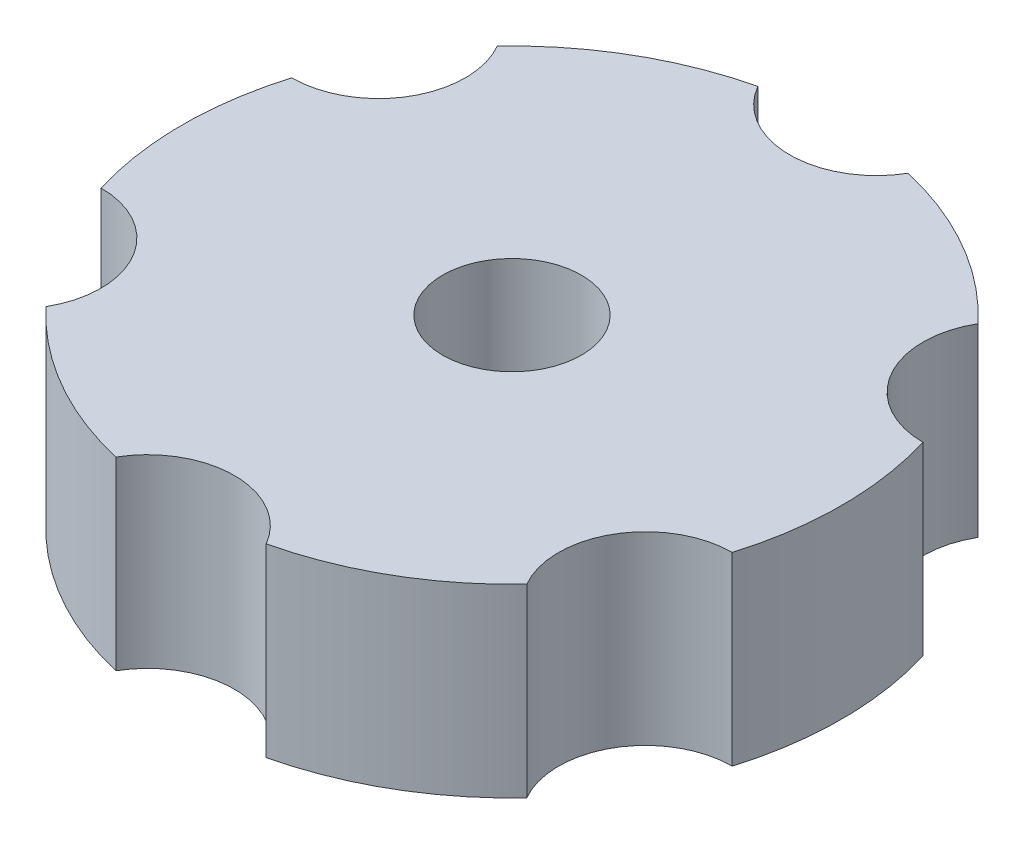
ISO-10303-21;
HEADER;
FILE_DESCRIPTION(('STEP AP214'),'2;1');
FILE_NAME('part.step','',(''),(''),'','','');
FILE_SCHEMA(('AUTOMOTIVE_DESIGN { 1 0 10303 214 1 1 1 1 }'));
ENDSEC;
DATA;
#1=APPLICATION_CONTEXT('core data for automotive mechanical design processes');
#2=APPLICATION_PROTOCOL_DEFINITION('international standard','automotive_design',2000,#1);
#3=PRODUCT_CONTEXT('',#1,'mechanical');
#4=PRODUCT('Part','Part','',(#3));
#5=PRODUCT_RELATED_PRODUCT_CATEGORY('part','',(#4));
#6=PRODUCT_DEFINITION_FORMATION('','',#4);
#7=PRODUCT_DEFINITION_CONTEXT('part definition',#1,'design');
#8=PRODUCT_DEFINITION('design','',#6,#7);
#9=PRODUCT_DEFINITION_SHAPE('','',#8);
#10=(LENGTH_UNIT() NAMED_UNIT(*) SI_UNIT(.MILLI.,.METRE.));
#11=(NAMED_UNIT(*) PLANE_ANGLE_UNIT() SI_UNIT($,.RADIAN.));
#12=(NAMED_UNIT(*) SI_UNIT($,.STERADIAN.) SOLID_ANGLE_UNIT());
#13=UNCERTAINTY_MEASURE_WITH_UNIT(LENGTH_MEASURE(1.E-05),#10,'distance_accuracy_value','');
#14=(GEOMETRIC_REPRESENTATION_CONTEXT(3) GLOBAL_UNCERTAINTY_ASSIGNED_CONTEXT((#13)) GLOBAL_UNIT_ASSIGNED_CONTEXT((#10,
#11,#12)) REPRESENTATION_CONTEXT('',''));
#15=CARTESIAN_POINT('',(0.,0.,0.));
#16=DIRECTION('',(0.,0.,1.));
#17=DIRECTION('',(1.,0.,0.));
#18=AXIS2_PLACEMENT_3D('',#15,#16,#17);
#19=CARTESIAN_POINT('',(-27.2879949785759,16.,-15.7547312465264));
#20=DIRECTION('',(0.,-1.,0.));
#21=DIRECTION('',(0.,0.,-1.));
#22=AXIS2_PLACEMENT_3D('',#19,#20,#21);
#23=CYLINDRICAL_SURFACE('',#22,7.50946249305215);
#24=CARTESIAN_POINT('',(-27.2879949785759,0.,-15.7547312465264));
#25=DIRECTION('',(0.,1.,0.));
#26=DIRECTION('',(0.,0.,1.));
#27=AXIS2_PLACEMENT_3D('',#24,#25,#26);
#28=CIRCLE('',#27,7.50946249305215);
#29=CARTESIAN_POINT('',(-27.2812296813957,0.,-8.24527180091308));
#30=VERTEX_POINT('',#29);
#31=CARTESIAN_POINT('',(-20.7812296813956,0.,-19.5036020501107));
#32=VERTEX_POINT('',#31);
#33=EDGE_CURVE('E164',#30,#32,#28,.T.);
#34=ORIENTED_EDGE('',*,*,#33,.F.);
#35=DIRECTION('',(0.,-1.,0.));
#36=VECTOR('',#35,1.);
#37=CARTESIAN_POINT('',(-27.2812296813957,16.,-8.24527180091308));
#38=LINE('',#37,#36);
#39=CARTESIAN_POINT('',(-27.2812296813957,16.,-8.24527180091308));
#40=VERTEX_POINT('',#39);
#41=EDGE_CURVE('E11',#40,#30,#38,.T.);
#42=ORIENTED_EDGE('',*,*,#41,.F.);
#43=CARTESIAN_POINT('',(-27.2879949785759,16.,-15.7547312465264));
#44=DIRECTION('',(0.,1.,0.));
#45=DIRECTION('',(0.,0.,1.));
#46=AXIS2_PLACEMENT_3D('',#43,#44,#45);
#47=CIRCLE('',#46,7.50946249305215);
#48=CARTESIAN_POINT('',(-20.7812296813956,16.,-19.5036020501107));
#49=VERTEX_POINT('',#48);
#50=EDGE_CURVE('E229',#40,#49,#47,.T.);
#51=ORIENTED_EDGE('',*,*,#50,.T.);
#52=DIRECTION('',(0.,-1.,0.));
#53=VECTOR('',#52,1.);
#54=CARTESIAN_POINT('',(-20.7812296813956,16.,-19.5036020501107));
#55=LINE('',#54,#53);
#56=EDGE_CURVE('E104',#49,#32,#55,.T.);
#57=ORIENTED_EDGE('',*,*,#56,.T.);
#58=EDGE_LOOP('',(#34,#42,#51,#57));
#59=FACE_BOUND('',#58,.T.);
#60=ADVANCED_FACE('F41',(#59),#23,.F.);
#61=CARTESIAN_POINT('',(0.,16.,0.));
#62=DIRECTION('',(0.,-1.,0.));
#63=DIRECTION('',(0.,0.,-1.));
#64=AXIS2_PLACEMENT_3D('',#61,#62,#63);
#65=CYLINDRICAL_SURFACE('',#64,28.5);
#66=CARTESIAN_POINT('',(0.,0.,0.));
#67=DIRECTION('',(0.,1.,0.));
#68=DIRECTION('',(0.,0.,1.));
#69=AXIS2_PLACEMENT_3D('',#66,#67,#68);
#70=CIRCLE('',#69,28.5);
#71=CARTESIAN_POINT('',(-27.2812296813959,0.,8.24527180091251));
#72=VERTEX_POINT('',#71);
#73=EDGE_CURVE('E167',#30,#72,#70,.T.);
#74=ORIENTED_EDGE('',*,*,#73,.T.);
#75=DIRECTION('',(0.,-1.,0.));
#76=VECTOR('',#75,1.);
#77=CARTESIAN_POINT('',(-27.2812296813959,16.,8.24527180091251));
#78=LINE('',#77,#76);
#79=CARTESIAN_POINT('',(-27.2812296813959,16.,8.24527180091251));
#80=VERTEX_POINT('',#79);
#81=EDGE_CURVE('E50',#80,#72,#78,.T.);
#82=ORIENTED_EDGE('',*,*,#81,.F.);
#83=CARTESIAN_POINT('',(0.,16.,0.));
#84=DIRECTION('',(0.,1.,0.));
#85=DIRECTION('',(0.,0.,1.));
#86=AXIS2_PLACEMENT_3D('',#83,#84,#85);
#87=CIRCLE('',#86,28.5);
#88=EDGE_CURVE('E157',#40,#80,#87,.T.);
#89=ORIENTED_EDGE('',*,*,#88,.F.);
#90=ORIENTED_EDGE('',*,*,#41,.T.);
#91=EDGE_LOOP('',(#74,#82,#89,#90));
#92=FACE_BOUND('',#91,.T.);
#93=ADVANCED_FACE('F211',(#92),#65,.T.);
#94=CARTESIAN_POINT('',(-27.2879949785763,16.,15.7547312465258));
#95=DIRECTION('',(0.,-1.,0.));
#96=DIRECTION('',(0.,0.,-1.));
#97=AXIS2_PLACEMENT_3D('',#94,#95,#96);
#98=CYLINDRICAL_SURFACE('',#97,7.50946249305215);
#99=CARTESIAN_POINT('',(-27.2879949785763,0.,15.7547312465258));
#100=DIRECTION('',(0.,1.,0.));
#101=DIRECTION('',(0.,0.,1.));
#102=AXIS2_PLACEMENT_3D('',#99,#100,#101);
#103=CIRCLE('',#102,7.50946249305215);
#104=CARTESIAN_POINT('',(-20.781229681396,0.,19.5036020501103));
#105=VERTEX_POINT('',#104);
#106=EDGE_CURVE('E170',#105,#72,#103,.T.);
#107=ORIENTED_EDGE('',*,*,#106,.F.);
#108=DIRECTION('',(0.,-1.,0.));
#109=VECTOR('',#108,1.);
#110=CARTESIAN_POINT('',(-20.781229681396,16.,19.5036020501103));
#111=LINE('',#110,#109);
#112=CARTESIAN_POINT('',(-20.781229681396,16.,19.5036020501103));
#113=VERTEX_POINT('',#112);
#114=EDGE_CURVE('E201',#113,#105,#111,.T.);
#115=ORIENTED_EDGE('',*,*,#114,.F.);
#116=CARTESIAN_POINT('',(-27.2879949785763,16.,15.7547312465258));
#117=DIRECTION('',(0.,1.,0.));
#118=DIRECTION('',(0.,0.,1.));
#119=AXIS2_PLACEMENT_3D('',#116,#117,#118);
#120=CIRCLE('',#119,7.50946249305215);
#121=EDGE_CURVE('E208',#113,#80,#120,.T.);
#122=ORIENTED_EDGE('',*,*,#121,.T.);
#123=ORIENTED_EDGE('',*,*,#81,.T.);
#124=EDGE_LOOP('',(#107,#115,#122,#123));
#125=FACE_BOUND('',#124,.T.);
#126=ADVANCED_FACE('F206',(#125),#98,.F.);
#127=CARTESIAN_POINT('',(-6.50000000000019,0.,27.7488738510232));
#128=VERTEX_POINT('',#127);
#129=EDGE_CURVE('E172',#105,#128,#70,.T.);
#130=ORIENTED_EDGE('',*,*,#129,.T.);
#131=DIRECTION('',(0.,-1.,0.));
#132=VECTOR('',#131,1.);
#133=CARTESIAN_POINT('',(-6.50000000000019,16.,27.7488738510232));
#134=LINE('',#133,#132);
#135=CARTESIAN_POINT('',(-6.50000000000019,16.,27.7488738510232));
#136=VERTEX_POINT('',#135);
#137=EDGE_CURVE('E199',#136,#128,#134,.T.);
#138=ORIENTED_EDGE('',*,*,#137,.F.);
#139=EDGE_CURVE('E235',#113,#136,#87,.T.);
#140=ORIENTED_EDGE('',*,*,#139,.F.);
#141=ORIENTED_EDGE('',*,*,#114,.T.);
#142=EDGE_LOOP('',(#130,#138,#140,#141));
#143=FACE_BOUND('',#142,.T.);
#144=ADVANCED_FACE('F247',(#143),#65,.T.);
#145=CARTESIAN_POINT('',(-2.20029400582938E-13,16.,31.5094624930522));
#146=DIRECTION('',(0.,-1.,0.));
#147=DIRECTION('',(0.,0.,-1.));
#148=AXIS2_PLACEMENT_3D('',#145,#146,#147);
#149=CYLINDRICAL_SURFACE('',#148,7.50946249305215);
#150=CARTESIAN_POINT('',(-2.20029400582938E-13,0.,31.5094624930522));
#151=DIRECTION('',(0.,1.,0.));
#152=DIRECTION('',(0.,0.,1.));
#153=AXIS2_PLACEMENT_3D('',#150,#151,#152);
#154=CIRCLE('',#153,7.50946249305215);
#155=CARTESIAN_POINT('',(6.4999999999998,0.,27.7488738510233));
#156=VERTEX_POINT('',#155);
#157=EDGE_CURVE('E175',#156,#128,#154,.T.);
#158=ORIENTED_EDGE('',*,*,#157,.F.);
#159=DIRECTION('',(0.,-1.,0.));
#160=VECTOR('',#159,1.);
#161=CARTESIAN_POINT('',(6.4999999999998,16.,27.7488738510233));
#162=LINE('',#161,#160);
#163=CARTESIAN_POINT('',(6.4999999999998,16.,27.7488738510233));
#164=VERTEX_POINT('',#163);
#165=EDGE_CURVE('E197',#164,#156,#162,.T.);
#166=ORIENTED_EDGE('',*,*,#165,.F.);
#167=CARTESIAN_POINT('',(-2.20029400582938E-13,16.,31.5094624930522));
#168=DIRECTION('',(0.,1.,0.));
#169=DIRECTION('',(0.,0.,1.));
#170=AXIS2_PLACEMENT_3D('',#167,#168,#169);
#171=CIRCLE('',#170,7.50946249305215);
#172=EDGE_CURVE('E237',#164,#136,#171,.T.);
#173=ORIENTED_EDGE('',*,*,#172,.T.);
#174=ORIENTED_EDGE('',*,*,#137,.T.);
#175=EDGE_LOOP('',(#158,#166,#173,#174));
#176=FACE_BOUND('',#175,.T.);
#177=ADVANCED_FACE('F249',(#176),#149,.F.);
#178=CARTESIAN_POINT('',(20.7812296813958,0.,19.5036020501105));
#179=VERTEX_POINT('',#178);
#180=EDGE_CURVE('E178',#156,#179,#70,.T.);
#181=ORIENTED_EDGE('',*,*,#180,.T.);
#182=DIRECTION('',(0.,-1.,0.));
#183=VECTOR('',#182,1.);
#184=CARTESIAN_POINT('',(20.7812296813958,16.,19.5036020501105));
#185=LINE('',#184,#183);
#186=CARTESIAN_POINT('',(20.7812296813958,16.,19.5036020501105));
#187=VERTEX_POINT('',#186);
#188=EDGE_CURVE('E195',#187,#179,#185,.T.);
#189=ORIENTED_EDGE('',*,*,#188,.F.);
#190=EDGE_CURVE('E239',#164,#187,#87,.T.);
#191=ORIENTED_EDGE('',*,*,#190,.F.);
#192=ORIENTED_EDGE('',*,*,#165,.T.);
#193=EDGE_LOOP('',(#181,#189,#191,#192));
#194=FACE_BOUND('',#193,.T.);
#195=ADVANCED_FACE('F250',(#194),#65,.T.);
#196=CARTESIAN_POINT('',(27.2879949785761,16.,15.7547312465262));
#197=DIRECTION('',(0.,-1.,0.));
#198=DIRECTION('',(0.,0.,-1.));
#199=AXIS2_PLACEMENT_3D('',#196,#197,#198);
#200=CYLINDRICAL_SURFACE('',#199,7.50946249305215);
#201=CARTESIAN_POINT('',(27.2879949785761,0.,15.7547312465262));
#202=DIRECTION('',(0.,1.,0.));
#203=DIRECTION('',(0.,0.,1.));
#204=AXIS2_PLACEMENT_3D('',#201,#202,#203);
#205=CIRCLE('',#204,7.50946249305215);
#206=CARTESIAN_POINT('',(27.2812296813958,0.,8.2452718009129));
#207=VERTEX_POINT('',#206);
#208=EDGE_CURVE('E179',#207,#179,#205,.T.);
#209=ORIENTED_EDGE('',*,*,#208,.F.);
#210=DIRECTION('',(0.,-1.,0.));
#211=VECTOR('',#210,1.);
#212=CARTESIAN_POINT('',(27.2812296813958,16.,8.2452718009129));
#213=LINE('',#212,#211);
#214=CARTESIAN_POINT('',(27.2812296813958,16.,8.2452718009129));
#215=VERTEX_POINT('',#214);
#216=EDGE_CURVE('E193',#215,#207,#213,.T.);
#217=ORIENTED_EDGE('',*,*,#216,.F.);
#218=CARTESIAN_POINT('',(27.2879949785761,16.,15.7547312465262));
#219=DIRECTION('',(0.,1.,0.));
#220=DIRECTION('',(0.,0.,1.));
#221=AXIS2_PLACEMENT_3D('',#218,#219,#220);
#222=CIRCLE('',#221,7.50946249305215);
#223=EDGE_CURVE('E240',#215,#187,#222,.T.);
#224=ORIENTED_EDGE('',*,*,#223,.T.);
#225=ORIENTED_EDGE('',*,*,#188,.T.);
#226=EDGE_LOOP('',(#209,#217,#224,#225));
#227=FACE_BOUND('',#226,.T.);
#228=ADVANCED_FACE('F252',(#227),#200,.F.);
#229=CARTESIAN_POINT('',(27.2812296813959,0.,-8.24527180091271));
#230=VERTEX_POINT('',#229);
#231=EDGE_CURVE('E182',#207,#230,#70,.T.);
#232=ORIENTED_EDGE('',*,*,#231,.T.);
#233=DIRECTION('',(0.,-1.,0.));
#234=VECTOR('',#233,1.);
#235=CARTESIAN_POINT('',(27.2812296813959,16.,-8.24527180091271));
#236=LINE('',#235,#234);
#237=CARTESIAN_POINT('',(27.2812296813959,16.,-8.24527180091271));
#238=VERTEX_POINT('',#237);
#239=EDGE_CURVE('E191',#238,#230,#236,.T.);
#240=ORIENTED_EDGE('',*,*,#239,.F.);
#241=EDGE_CURVE('E144',#215,#238,#87,.T.);
#242=ORIENTED_EDGE('',*,*,#241,.F.);
#243=ORIENTED_EDGE('',*,*,#216,.T.);
#244=EDGE_LOOP('',(#232,#240,#242,#243));
#245=FACE_BOUND('',#244,.T.);
#246=ADVANCED_FACE('F257',(#245),#65,.T.);
#247=CARTESIAN_POINT('',(27.2879949785762,16.,-15.754731246526));
#248=DIRECTION('',(0.,-1.,0.));
#249=DIRECTION('',(0.,0.,-1.));
#250=AXIS2_PLACEMENT_3D('',#247,#248,#249);
#251=CYLINDRICAL_SURFACE('',#250,7.50946249305215);
#252=CARTESIAN_POINT('',(27.2879949785762,0.,-15.754731246526));
#253=DIRECTION('',(0.,1.,0.));
#254=DIRECTION('',(0.,0.,1.));
#255=AXIS2_PLACEMENT_3D('',#252,#253,#254);
#256=CIRCLE('',#255,7.50946249305215);
#257=CARTESIAN_POINT('',(20.7812296813959,0.,-19.5036020501104));
#258=VERTEX_POINT('',#257);
#259=EDGE_CURVE('E183',#258,#230,#256,.T.);
#260=ORIENTED_EDGE('',*,*,#259,.F.);
#261=DIRECTION('',(0.,-1.,0.));
#262=VECTOR('',#261,1.);
#263=CARTESIAN_POINT('',(20.7812296813959,16.,-19.5036020501104));
#264=LINE('',#263,#262);
#265=CARTESIAN_POINT('',(20.7812296813959,16.,-19.5036020501104));
#266=VERTEX_POINT('',#265);
#267=EDGE_CURVE('E153',#266,#258,#264,.T.);
#268=ORIENTED_EDGE('',*,*,#267,.F.);
#269=CARTESIAN_POINT('',(27.2879949785762,16.,-15.754731246526));
#270=DIRECTION('',(0.,1.,0.));
#271=DIRECTION('',(0.,0.,1.));
#272=AXIS2_PLACEMENT_3D('',#269,#270,#271);
#273=CIRCLE('',#272,7.50946249305215);
#274=EDGE_CURVE('E141',#266,#238,#273,.T.);
#275=ORIENTED_EDGE('',*,*,#274,.T.);
#276=ORIENTED_EDGE('',*,*,#239,.T.);
#277=EDGE_LOOP('',(#260,#268,#275,#276));
#278=FACE_BOUND('',#277,.T.);
#279=ADVANCED_FACE('F256',(#278),#251,.F.);
#280=CARTESIAN_POINT('',(6.5,0.,-27.7488738510232));
#281=VERTEX_POINT('',#280);
#282=EDGE_CURVE('E149',#258,#281,#70,.T.);
#283=ORIENTED_EDGE('',*,*,#282,.T.);
#284=DIRECTION('',(0.,-1.,0.));
#285=VECTOR('',#284,1.);
#286=CARTESIAN_POINT('',(6.5,16.,-27.7488738510232));
#287=LINE('',#286,#285);
#288=CARTESIAN_POINT('',(6.5,16.,-27.7488738510232));
#289=VERTEX_POINT('',#288);
#290=EDGE_CURVE('E146',#289,#281,#287,.T.);
#291=ORIENTED_EDGE('',*,*,#290,.F.);
#292=EDGE_CURVE('E135',#266,#289,#87,.T.);
#293=ORIENTED_EDGE('',*,*,#292,.F.);
#294=ORIENTED_EDGE('',*,*,#267,.T.);
#295=EDGE_LOOP('',(#283,#291,#293,#294));
#296=FACE_BOUND('',#295,.T.);
#297=ADVANCED_FACE('F147',(#296),#65,.T.);
#298=CARTESIAN_POINT('',(0.,16.,-31.5094624930522));
#299=DIRECTION('',(0.,-1.,0.));
#300=DIRECTION('',(0.,0.,-1.));
#301=AXIS2_PLACEMENT_3D('',#298,#299,#300);
#302=CYLINDRICAL_SURFACE('',#301,7.50946249305215);
#303=CARTESIAN_POINT('',(0.,0.,-31.5094624930522));
#304=DIRECTION('',(0.,1.,0.));
#305=DIRECTION('',(0.,0.,1.));
#306=AXIS2_PLACEMENT_3D('',#303,#304,#305);
#307=CIRCLE('',#306,7.50946249305215);
#308=CARTESIAN_POINT('',(-6.5,0.,-27.7488738510232));
#309=VERTEX_POINT('',#308);
#310=EDGE_CURVE('E186',#309,#281,#307,.T.);
#311=ORIENTED_EDGE('',*,*,#310,.F.);
#312=DIRECTION('',(0.,-1.,0.));
#313=VECTOR('',#312,1.);
#314=CARTESIAN_POINT('',(-6.5,16.,-27.7488738510232));
#315=LINE('',#314,#313);
#316=CARTESIAN_POINT('',(-6.5,16.,-27.7488738510232));
#317=VERTEX_POINT('',#316);
#318=EDGE_CURVE('E97',#317,#309,#315,.T.);
#319=ORIENTED_EDGE('',*,*,#318,.F.);
#320=CARTESIAN_POINT('',(0.,16.,-31.5094624930522));
#321=DIRECTION('',(0.,1.,0.));
#322=DIRECTION('',(0.,0.,1.));
#323=AXIS2_PLACEMENT_3D('',#320,#321,#322);
#324=CIRCLE('',#323,7.50946249305215);
#325=EDGE_CURVE('E139',#317,#289,#324,.T.);
#326=ORIENTED_EDGE('',*,*,#325,.T.);
#327=ORIENTED_EDGE('',*,*,#290,.T.);
#328=EDGE_LOOP('',(#311,#319,#326,#327));
#329=FACE_BOUND('',#328,.T.);
#330=ADVANCED_FACE('F155',(#329),#302,.F.);
#331=CARTESIAN_POINT('',(0.,16.,0.));
#332=DIRECTION('',(0.,-1.,0.));
#333=DIRECTION('',(0.,0.,-1.));
#334=AXIS2_PLACEMENT_3D('',#331,#332,#333);
#335=CYLINDRICAL_SURFACE('',#334,6.);
#336=CARTESIAN_POINT('',(0.,16.,0.));
#337=DIRECTION('',(0.,1.,0.));
#338=DIRECTION('',(0.,0.,1.));
#339=AXIS2_PLACEMENT_3D('',#336,#337,#338);
#340=CIRCLE('',#339,6.);
#341=CARTESIAN_POINT('',(0.,16.,6.));
#342=VERTEX_POINT('',#341);
#343=EDGE_CURVE('E227',#342,#342,#340,.T.);
#344=ORIENTED_EDGE('',*,*,#343,.T.);
#345=EDGE_LOOP('',(#344));
#346=FACE_BOUND('',#345,.T.);
#347=CARTESIAN_POINT('',(0.,0.,0.));
#348=DIRECTION('',(0.,1.,0.));
#349=DIRECTION('',(0.,0.,1.));
#350=AXIS2_PLACEMENT_3D('',#347,#348,#349);
#351=CIRCLE('',#350,6.);
#352=CARTESIAN_POINT('',(0.,0.,6.));
#353=VERTEX_POINT('',#352);
#354=EDGE_CURVE('E161',#353,#353,#351,.T.);
#355=ORIENTED_EDGE('',*,*,#354,.F.);
#356=EDGE_LOOP('',(#355));
#357=FACE_BOUND('',#356,.T.);
#358=ADVANCED_FACE('F43',(#346,#357),#335,.F.);
#359=EDGE_CURVE('E171',#309,#32,#70,.T.);
#360=ORIENTED_EDGE('',*,*,#359,.T.);
#361=ORIENTED_EDGE('',*,*,#56,.F.);
#362=EDGE_CURVE('E58',#317,#49,#87,.T.);
#363=ORIENTED_EDGE('',*,*,#362,.F.);
#364=ORIENTED_EDGE('',*,*,#318,.T.);
#365=EDGE_LOOP('',(#360,#361,#363,#364));
#366=FACE_BOUND('',#365,.T.);
#367=ADVANCED_FACE('F266',(#366),#65,.T.);
#368=CARTESIAN_POINT('',(0.,16.,0.));
#369=DIRECTION('',(0.,1.,0.));
#370=DIRECTION('',(0.,0.,1.));
#371=AXIS2_PLACEMENT_3D('',#368,#369,#370);
#372=PLANE('',#371);
#373=ORIENTED_EDGE('',*,*,#343,.F.);
#374=EDGE_LOOP('',(#373));
#375=FACE_BOUND('',#374,.T.);
#376=ORIENTED_EDGE('',*,*,#50,.F.);
#377=ORIENTED_EDGE('',*,*,#88,.T.);
#378=ORIENTED_EDGE('',*,*,#121,.F.);
#379=ORIENTED_EDGE('',*,*,#139,.T.);
#380=ORIENTED_EDGE('',*,*,#172,.F.);
#381=ORIENTED_EDGE('',*,*,#190,.T.);
#382=ORIENTED_EDGE('',*,*,#223,.F.);
#383=ORIENTED_EDGE('',*,*,#241,.T.);
#384=ORIENTED_EDGE('',*,*,#274,.F.);
#385=ORIENTED_EDGE('',*,*,#292,.T.);
#386=ORIENTED_EDGE('',*,*,#325,.F.);
#387=ORIENTED_EDGE('',*,*,#362,.T.);
#388=EDGE_LOOP('',(#376,#377,#378,#379,#380,#381,#382,#383,#384,#385,#386,#387));
#389=FACE_BOUND('',#388,.T.);
#390=ADVANCED_FACE('F137',(#375,#389),#372,.T.);
#391=CARTESIAN_POINT('',(0.,0.,0.));
#392=DIRECTION('',(0.,1.,0.));
#393=DIRECTION('',(0.,0.,1.));
#394=AXIS2_PLACEMENT_3D('',#391,#392,#393);
#395=PLANE('',#394);
#396=ORIENTED_EDGE('',*,*,#354,.T.);
#397=EDGE_LOOP('',(#396));
#398=FACE_BOUND('',#397,.T.);
#399=ORIENTED_EDGE('',*,*,#33,.T.);
#400=ORIENTED_EDGE('',*,*,#359,.F.);
#401=ORIENTED_EDGE('',*,*,#310,.T.);
#402=ORIENTED_EDGE('',*,*,#282,.F.);
#403=ORIENTED_EDGE('',*,*,#259,.T.);
#404=ORIENTED_EDGE('',*,*,#231,.F.);
#405=ORIENTED_EDGE('',*,*,#208,.T.);
#406=ORIENTED_EDGE('',*,*,#180,.F.);
#407=ORIENTED_EDGE('',*,*,#157,.T.);
#408=ORIENTED_EDGE('',*,*,#129,.F.);
#409=ORIENTED_EDGE('',*,*,#106,.T.);
#410=ORIENTED_EDGE('',*,*,#73,.F.);
#411=EDGE_LOOP('',(#399,#400,#401,#402,#403,#404,#405,#406,#407,#408,#409,#410));
#412=FACE_BOUND('',#411,.T.);
#413=ADVANCED_FACE('F214',(#398,#412),#395,.F.);
#414=CLOSED_SHELL('',(#60,#93,#126,#144,#177,#195,#228,#246,#279,#297,#330,#358,#367,#390,#413));
#415=MANIFOLD_SOLID_BREP('B2',#414);
#416=ADVANCED_BREP_SHAPE_REPRESENTATION('',(#18,#415),#14);
#417=SHAPE_DEFINITION_REPRESENTATION(#9,#416);
ENDSEC;
END-ISO-10303-21;
